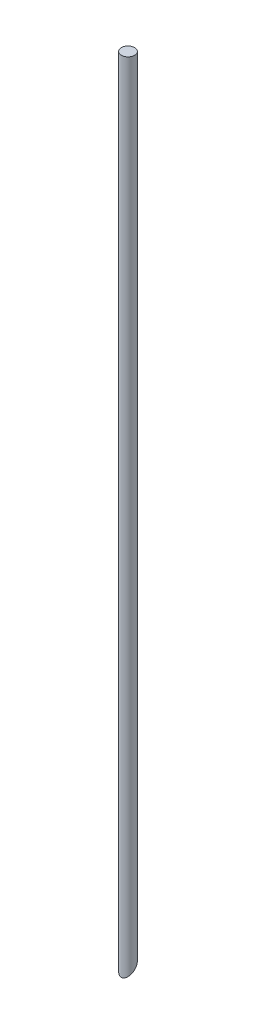
ISO-10303-21;
HEADER;
FILE_DESCRIPTION(('STEP AP214'),'2;1');
FILE_NAME('part.step','',(''),(''),'','','');
FILE_SCHEMA(('AUTOMOTIVE_DESIGN { 1 0 10303 214 1 1 1 1 }'));
ENDSEC;
DATA;
#1=APPLICATION_CONTEXT('core data for automotive mechanical design processes');
#2=APPLICATION_PROTOCOL_DEFINITION('international standard','automotive_design',2000,#1);
#3=PRODUCT_CONTEXT('',#1,'mechanical');
#4=PRODUCT('Part','Part','',(#3));
#5=PRODUCT_RELATED_PRODUCT_CATEGORY('part','',(#4));
#6=PRODUCT_DEFINITION_FORMATION('','',#4);
#7=PRODUCT_DEFINITION_CONTEXT('part definition',#1,'design');
#8=PRODUCT_DEFINITION('design','',#6,#7);
#9=PRODUCT_DEFINITION_SHAPE('','',#8);
#10=(LENGTH_UNIT() NAMED_UNIT(*) SI_UNIT(.MILLI.,.METRE.));
#11=(NAMED_UNIT(*) PLANE_ANGLE_UNIT() SI_UNIT($,.RADIAN.));
#12=(NAMED_UNIT(*) SI_UNIT($,.STERADIAN.) SOLID_ANGLE_UNIT());
#13=UNCERTAINTY_MEASURE_WITH_UNIT(LENGTH_MEASURE(1.E-05),#10,'distance_accuracy_value','');
#14=(GEOMETRIC_REPRESENTATION_CONTEXT(3) GLOBAL_UNCERTAINTY_ASSIGNED_CONTEXT((#13)) GLOBAL_UNIT_ASSIGNED_CONTEXT((#10,
#11,#12)) REPRESENTATION_CONTEXT('',''));
#15=CARTESIAN_POINT('',(0.,0.,0.));
#16=DIRECTION('',(0.,0.,1.));
#17=DIRECTION('',(1.,0.,0.));
#18=AXIS2_PLACEMENT_3D('',#15,#16,#17);
#19=CARTESIAN_POINT('',(0.,600.,0.));
#20=DIRECTION('',(0.,-1.,0.));
#21=DIRECTION('',(0.,0.,-1.));
#22=AXIS2_PLACEMENT_3D('',#19,#20,#21);
#23=CYLINDRICAL_SURFACE('',#22,5.);
#24=CARTESIAN_POINT('',(0.,600.,0.));
#25=DIRECTION('',(0.,1.,0.));
#26=DIRECTION('',(0.,0.,1.));
#27=AXIS2_PLACEMENT_3D('',#24,#25,#26);
#28=CIRCLE('',#27,5.);
#29=CARTESIAN_POINT('',(0.,600.,5.));
#30=VERTEX_POINT('',#29);
#31=EDGE_CURVE('E10',#30,#30,#28,.T.);
#32=ORIENTED_EDGE('',*,*,#31,.F.);
#33=EDGE_LOOP('',(#32));
#34=FACE_BOUND('',#33,.T.);
#35=CARTESIAN_POINT('',(0.,5.,0.));
#36=DIRECTION('',(0.,0.707106781186546,0.707106781186549));
#37=DIRECTION('',(0.,-0.707106781186549,0.707106781186546));
#38=AXIS2_PLACEMENT_3D('',#35,#36,#37);
#39=ELLIPSE('',#38,7.07106781186549,5.);
#40=CARTESIAN_POINT('',(0.,0.,5.));
#41=VERTEX_POINT('',#40);
#42=EDGE_CURVE('E44',#41,#41,#39,.T.);
#43=ORIENTED_EDGE('',*,*,#42,.T.);
#44=EDGE_LOOP('',(#43));
#45=FACE_BOUND('',#44,.T.);
#46=ADVANCED_FACE('F37',(#34,#45),#23,.T.);
#47=CARTESIAN_POINT('',(0.,600.,0.));
#48=DIRECTION('',(0.,1.,0.));
#49=DIRECTION('',(0.,0.,1.));
#50=AXIS2_PLACEMENT_3D('',#47,#48,#49);
#51=PLANE('',#50);
#52=ORIENTED_EDGE('',*,*,#31,.T.);
#53=EDGE_LOOP('',(#52));
#54=FACE_BOUND('',#53,.T.);
#55=ADVANCED_FACE('F54',(#54),#51,.T.);
#56=CARTESIAN_POINT('',(-5.,0.,5.));
#57=DIRECTION('',(0.,0.707106781186546,0.707106781186549));
#58=DIRECTION('',(0.,-0.707106781186549,0.707106781186546));
#59=AXIS2_PLACEMENT_3D('',#56,#57,#58);
#60=PLANE('',#59);
#61=ORIENTED_EDGE('',*,*,#42,.F.);
#62=EDGE_LOOP('',(#61));
#63=FACE_BOUND('',#62,.T.);
#64=ADVANCED_FACE('F52',(#63),#60,.F.);
#65=CLOSED_SHELL('',(#46,#55,#64));
#66=MANIFOLD_SOLID_BREP('B2',#65);
#67=ADVANCED_BREP_SHAPE_REPRESENTATION('',(#18,#66),#14);
#68=SHAPE_DEFINITION_REPRESENTATION(#9,#67);
ENDSEC;
END-ISO-10303-21;
